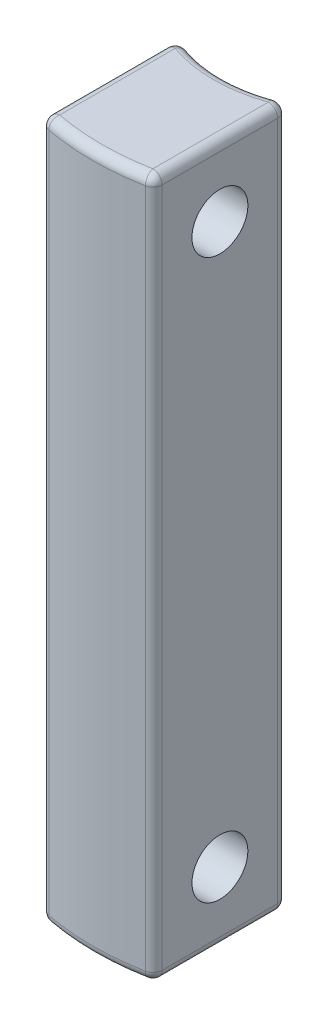
ISO-10303-21;
HEADER;
FILE_DESCRIPTION(('STEP AP214'),'2;1');
FILE_NAME('part.step','',(''),(''),'','','');
FILE_SCHEMA(('AUTOMOTIVE_DESIGN { 1 0 10303 214 1 1 1 1 }'));
ENDSEC;
DATA;
#1=APPLICATION_CONTEXT('core data for automotive mechanical design processes');
#2=APPLICATION_PROTOCOL_DEFINITION('international standard','automotive_design',2000,#1);
#3=PRODUCT_CONTEXT('',#1,'mechanical');
#4=PRODUCT('Part','Part','',(#3));
#5=PRODUCT_RELATED_PRODUCT_CATEGORY('part','',(#4));
#6=PRODUCT_DEFINITION_FORMATION('','',#4);
#7=PRODUCT_DEFINITION_CONTEXT('part definition',#1,'design');
#8=PRODUCT_DEFINITION('design','',#6,#7);
#9=PRODUCT_DEFINITION_SHAPE('','',#8);
#10=(LENGTH_UNIT() NAMED_UNIT(*) SI_UNIT(.MILLI.,.METRE.));
#11=(NAMED_UNIT(*) PLANE_ANGLE_UNIT() SI_UNIT($,.RADIAN.));
#12=(NAMED_UNIT(*) SI_UNIT($,.STERADIAN.) SOLID_ANGLE_UNIT());
#13=UNCERTAINTY_MEASURE_WITH_UNIT(LENGTH_MEASURE(1.E-05),#10,'distance_accuracy_value','');
#14=(GEOMETRIC_REPRESENTATION_CONTEXT(3) GLOBAL_UNCERTAINTY_ASSIGNED_CONTEXT((#13)) GLOBAL_UNIT_ASSIGNED_CONTEXT((#10,
#11,#12)) REPRESENTATION_CONTEXT('',''));
#15=CARTESIAN_POINT('',(0.,0.,0.));
#16=DIRECTION('',(0.,0.,1.));
#17=DIRECTION('',(1.,0.,0.));
#18=AXIS2_PLACEMENT_3D('',#15,#16,#17);
#19=CARTESIAN_POINT('',(-5.,75.,26.5329983228432));
#20=DIRECTION('',(0.,-1.,0.));
#21=DIRECTION('',(0.,0.,-1.));
#22=AXIS2_PLACEMENT_3D('',#19,#20,#21);
#23=CYLINDRICAL_SURFACE('',#22,1.);
#24=DIRECTION('',(0.,-1.,0.));
#25=VECTOR('',#24,1.);
#26=CARTESIAN_POINT('',(-6.,75.,26.5329983228432));
#27=LINE('',#26,#25);
#28=CARTESIAN_POINT('',(-6.,74.,26.5329983228432));
#29=VERTEX_POINT('',#28);
#30=CARTESIAN_POINT('',(-6.,1.,26.5329983228432));
#31=VERTEX_POINT('',#30);
#32=EDGE_CURVE('E270',#29,#31,#27,.T.);
#33=ORIENTED_EDGE('',*,*,#32,.T.);
#34=CARTESIAN_POINT('',(-5.,1.,26.5329983228432));
#35=DIRECTION('',(0.,-1.,0.));
#36=DIRECTION('',(0.,0.,-1.));
#37=AXIS2_PLACEMENT_3D('',#34,#35,#36);
#38=CIRCLE('',#37,1.);
#39=CARTESIAN_POINT('',(-5.18518518518518,1.,27.51570196443));
#40=VERTEX_POINT('',#39);
#41=EDGE_CURVE('E230',#31,#40,#38,.F.);
#42=ORIENTED_EDGE('',*,*,#41,.T.);
#43=DIRECTION('',(0.,-1.,0.));
#44=VECTOR('',#43,1.);
#45=CARTESIAN_POINT('',(-5.18518518518518,75.,27.51570196443));
#46=LINE('',#45,#44);
#47=CARTESIAN_POINT('',(-5.18518518518518,74.,27.51570196443));
#48=VERTEX_POINT('',#47);
#49=EDGE_CURVE('E158',#48,#40,#46,.T.);
#50=ORIENTED_EDGE('',*,*,#49,.F.);
#51=CARTESIAN_POINT('',(-5.,74.,26.5329983228432));
#52=DIRECTION('',(0.,-1.,0.));
#53=DIRECTION('',(0.,0.,-1.));
#54=AXIS2_PLACEMENT_3D('',#51,#52,#53);
#55=CIRCLE('',#54,1.);
#56=EDGE_CURVE('E227',#48,#29,#55,.T.);
#57=ORIENTED_EDGE('',*,*,#56,.T.);
#58=EDGE_LOOP('',(#33,#42,#50,#57));
#59=FACE_BOUND('',#58,.T.);
#60=ADVANCED_FACE('F43',(#59),#23,.T.);
#61=CARTESIAN_POINT('',(0.,75.,0.));
#62=DIRECTION('',(0.,-1.,0.));
#63=DIRECTION('',(0.,0.,-1.));
#64=AXIS2_PLACEMENT_3D('',#61,#62,#63);
#65=CYLINDRICAL_SURFACE('',#64,28.);
#66=ORIENTED_EDGE('',*,*,#49,.T.);
#67=CARTESIAN_POINT('',(0.,1.,0.));
#68=DIRECTION('',(0.,-1.,0.));
#69=DIRECTION('',(0.,0.,-1.));
#70=AXIS2_PLACEMENT_3D('',#67,#68,#69);
#71=CIRCLE('',#70,28.);
#72=CARTESIAN_POINT('',(5.18518518518517,1.,27.51570196443));
#73=VERTEX_POINT('',#72);
#74=EDGE_CURVE('E156',#40,#73,#71,.F.);
#75=ORIENTED_EDGE('',*,*,#74,.T.);
#76=DIRECTION('',(0.,-1.,0.));
#77=VECTOR('',#76,1.);
#78=CARTESIAN_POINT('',(5.18518518518517,75.,27.51570196443));
#79=LINE('',#78,#77);
#80=CARTESIAN_POINT('',(5.18518518518517,74.,27.51570196443));
#81=VERTEX_POINT('',#80);
#82=EDGE_CURVE('E137',#81,#73,#79,.T.);
#83=ORIENTED_EDGE('',*,*,#82,.F.);
#84=CARTESIAN_POINT('',(0.,74.,0.));
#85=DIRECTION('',(0.,-1.,0.));
#86=DIRECTION('',(0.,0.,-1.));
#87=AXIS2_PLACEMENT_3D('',#84,#85,#86);
#88=CIRCLE('',#87,28.);
#89=EDGE_CURVE('E153',#81,#48,#88,.T.);
#90=ORIENTED_EDGE('',*,*,#89,.T.);
#91=EDGE_LOOP('',(#66,#75,#83,#90));
#92=FACE_BOUND('',#91,.T.);
#93=ADVANCED_FACE('F151',(#92),#65,.T.);
#94=CARTESIAN_POINT('',(5.,75.,26.5329983228432));
#95=DIRECTION('',(0.,-1.,0.));
#96=DIRECTION('',(0.,0.,-1.));
#97=AXIS2_PLACEMENT_3D('',#94,#95,#96);
#98=CYLINDRICAL_SURFACE('',#97,1.);
#99=ORIENTED_EDGE('',*,*,#82,.T.);
#100=CARTESIAN_POINT('',(5.,1.,26.5329983228432));
#101=DIRECTION('',(0.,-1.,0.));
#102=DIRECTION('',(0.,0.,-1.));
#103=AXIS2_PLACEMENT_3D('',#100,#101,#102);
#104=CIRCLE('',#103,1.);
#105=CARTESIAN_POINT('',(6.,1.,26.5329983228432));
#106=VERTEX_POINT('',#105);
#107=EDGE_CURVE('E145',#73,#106,#104,.F.);
#108=ORIENTED_EDGE('',*,*,#107,.T.);
#109=DIRECTION('',(0.,-1.,0.));
#110=VECTOR('',#109,1.);
#111=CARTESIAN_POINT('',(6.,75.,26.5329983228432));
#112=LINE('',#111,#110);
#113=CARTESIAN_POINT('',(6.,74.,26.5329983228432));
#114=VERTEX_POINT('',#113);
#115=EDGE_CURVE('E139',#114,#106,#112,.T.);
#116=ORIENTED_EDGE('',*,*,#115,.F.);
#117=CARTESIAN_POINT('',(5.,74.,26.5329983228432));
#118=DIRECTION('',(0.,-1.,0.));
#119=DIRECTION('',(0.,0.,-1.));
#120=AXIS2_PLACEMENT_3D('',#117,#118,#119);
#121=CIRCLE('',#120,1.);
#122=EDGE_CURVE('E134',#114,#81,#121,.T.);
#123=ORIENTED_EDGE('',*,*,#122,.T.);
#124=EDGE_LOOP('',(#99,#108,#116,#123));
#125=FACE_BOUND('',#124,.T.);
#126=ADVANCED_FACE('F136',(#125),#98,.T.);
#127=CARTESIAN_POINT('',(6.,75.,14.142135623731));
#128=DIRECTION('',(-1.,0.,0.));
#129=DIRECTION('',(0.,0.,1.));
#130=AXIS2_PLACEMENT_3D('',#127,#128,#129);
#131=PLANE('',#130);
#132=CARTESIAN_POINT('',(6.,7.49999999999999,20.3375669732871));
#133=DIRECTION('',(1.,0.,0.));
#134=DIRECTION('',(0.,0.,-1.));
#135=AXIS2_PLACEMENT_3D('',#132,#133,#134);
#136=CIRCLE('',#135,3.);
#137=CARTESIAN_POINT('',(6.,7.49999999999999,17.3375669732871));
#138=VERTEX_POINT('',#137);
#139=EDGE_CURVE('E330',#138,#138,#136,.T.);
#140=ORIENTED_EDGE('',*,*,#139,.F.);
#141=EDGE_LOOP('',(#140));
#142=FACE_BOUND('',#141,.T.);
#143=CARTESIAN_POINT('',(6.,67.5,20.3375669732871));
#144=DIRECTION('',(1.,0.,0.));
#145=DIRECTION('',(0.,0.,1.));
#146=AXIS2_PLACEMENT_3D('',#143,#144,#145);
#147=CIRCLE('',#146,3.);
#148=CARTESIAN_POINT('',(6.,67.5,23.3375669732871));
#149=VERTEX_POINT('',#148);
#150=EDGE_CURVE('E326',#149,#149,#147,.T.);
#151=ORIENTED_EDGE('',*,*,#150,.F.);
#152=EDGE_LOOP('',(#151));
#153=FACE_BOUND('',#152,.T.);
#154=ORIENTED_EDGE('',*,*,#115,.T.);
#155=DIRECTION('',(0.,0.,-1.));
#156=VECTOR('',#155,1.);
#157=CARTESIAN_POINT('',(6.,1.,14.142135623731));
#158=LINE('',#157,#156);
#159=CARTESIAN_POINT('',(6.,1.,14.142135623731));
#160=VERTEX_POINT('',#159);
#161=EDGE_CURVE('E199',#106,#160,#158,.T.);
#162=ORIENTED_EDGE('',*,*,#161,.T.);
#163=DIRECTION('',(0.,-1.,0.));
#164=VECTOR('',#163,1.);
#165=CARTESIAN_POINT('',(6.,75.,14.142135623731));
#166=LINE('',#165,#164);
#167=CARTESIAN_POINT('',(6.,74.,14.142135623731));
#168=VERTEX_POINT('',#167);
#169=EDGE_CURVE('E299',#168,#160,#166,.T.);
#170=ORIENTED_EDGE('',*,*,#169,.F.);
#171=DIRECTION('',(0.,0.,-1.));
#172=VECTOR('',#171,1.);
#173=CARTESIAN_POINT('',(6.,74.,14.142135623731));
#174=LINE('',#173,#172);
#175=EDGE_CURVE('E196',#168,#114,#174,.F.);
#176=ORIENTED_EDGE('',*,*,#175,.T.);
#177=EDGE_LOOP('',(#154,#162,#170,#176));
#178=FACE_BOUND('',#177,.T.);
#179=ADVANCED_FACE('F296',(#142,#153,#178),#131,.F.);
#180=CARTESIAN_POINT('',(5.,75.,14.142135623731));
#181=DIRECTION('',(0.,-1.,0.));
#182=DIRECTION('',(0.,0.,-1.));
#183=AXIS2_PLACEMENT_3D('',#180,#181,#182);
#184=CYLINDRICAL_SURFACE('',#183,0.999999999999999);
#185=ORIENTED_EDGE('',*,*,#169,.T.);
#186=CARTESIAN_POINT('',(5.,1.,14.142135623731));
#187=DIRECTION('',(0.,-1.,0.));
#188=DIRECTION('',(0.,0.,-1.));
#189=AXIS2_PLACEMENT_3D('',#186,#187,#188);
#190=CIRCLE('',#189,0.999999999999999);
#191=CARTESIAN_POINT('',(4.66666666666667,1.,13.1993265821489));
#192=VERTEX_POINT('',#191);
#193=EDGE_CURVE('E205',#160,#192,#190,.F.);
#194=ORIENTED_EDGE('',*,*,#193,.T.);
#195=DIRECTION('',(0.,-1.,0.));
#196=VECTOR('',#195,1.);
#197=CARTESIAN_POINT('',(4.66666666666667,75.,13.1993265821489));
#198=LINE('',#197,#196);
#199=CARTESIAN_POINT('',(4.66666666666667,74.,13.1993265821489));
#200=VERTEX_POINT('',#199);
#201=EDGE_CURVE('E303',#200,#192,#198,.T.);
#202=ORIENTED_EDGE('',*,*,#201,.F.);
#203=CARTESIAN_POINT('',(5.,74.,14.142135623731));
#204=DIRECTION('',(0.,-1.,0.));
#205=DIRECTION('',(0.,0.,-1.));
#206=AXIS2_PLACEMENT_3D('',#203,#204,#205);
#207=CIRCLE('',#206,0.999999999999999);
#208=EDGE_CURVE('E202',#200,#168,#207,.T.);
#209=ORIENTED_EDGE('',*,*,#208,.T.);
#210=EDGE_LOOP('',(#185,#194,#202,#209));
#211=FACE_BOUND('',#210,.T.);
#212=ADVANCED_FACE('F350',(#211),#184,.T.);
#213=CARTESIAN_POINT('',(0.,75.,0.));
#214=DIRECTION('',(0.,-1.,0.));
#215=DIRECTION('',(0.,0.,-1.));
#216=AXIS2_PLACEMENT_3D('',#213,#214,#215);
#217=CYLINDRICAL_SURFACE('',#216,14.);
#218=ORIENTED_EDGE('',*,*,#201,.T.);
#219=CARTESIAN_POINT('',(0.,1.,0.));
#220=DIRECTION('',(0.,-1.,0.));
#221=DIRECTION('',(0.,0.,-1.));
#222=AXIS2_PLACEMENT_3D('',#219,#220,#221);
#223=CIRCLE('',#222,14.);
#224=CARTESIAN_POINT('',(-4.66666666666667,1.,13.1993265821489));
#225=VERTEX_POINT('',#224);
#226=EDGE_CURVE('E211',#192,#225,#223,.T.);
#227=ORIENTED_EDGE('',*,*,#226,.T.);
#228=DIRECTION('',(0.,-1.,0.));
#229=VECTOR('',#228,1.);
#230=CARTESIAN_POINT('',(-4.66666666666667,75.,13.1993265821489));
#231=LINE('',#230,#229);
#232=CARTESIAN_POINT('',(-4.66666666666667,74.,13.1993265821489));
#233=VERTEX_POINT('',#232);
#234=EDGE_CURVE('E309',#233,#225,#231,.T.);
#235=ORIENTED_EDGE('',*,*,#234,.F.);
#236=CARTESIAN_POINT('',(0.,74.,0.));
#237=DIRECTION('',(0.,-1.,0.));
#238=DIRECTION('',(0.,0.,-1.));
#239=AXIS2_PLACEMENT_3D('',#236,#237,#238);
#240=CIRCLE('',#239,14.);
#241=EDGE_CURVE('E208',#233,#200,#240,.F.);
#242=ORIENTED_EDGE('',*,*,#241,.T.);
#243=EDGE_LOOP('',(#218,#227,#235,#242));
#244=FACE_BOUND('',#243,.T.);
#245=ADVANCED_FACE('F487',(#244),#217,.F.);
#246=CARTESIAN_POINT('',(-5.,75.,14.142135623731));
#247=DIRECTION('',(0.,-1.,0.));
#248=DIRECTION('',(0.,0.,-1.));
#249=AXIS2_PLACEMENT_3D('',#246,#247,#248);
#250=CYLINDRICAL_SURFACE('',#249,0.999999999999999);
#251=ORIENTED_EDGE('',*,*,#234,.T.);
#252=CARTESIAN_POINT('',(-5.,1.,14.142135623731));
#253=DIRECTION('',(0.,-1.,0.));
#254=DIRECTION('',(0.,0.,-1.));
#255=AXIS2_PLACEMENT_3D('',#252,#253,#254);
#256=CIRCLE('',#255,0.999999999999999);
#257=CARTESIAN_POINT('',(-6.,1.,14.142135623731));
#258=VERTEX_POINT('',#257);
#259=EDGE_CURVE('E217',#225,#258,#256,.F.);
#260=ORIENTED_EDGE('',*,*,#259,.T.);
#261=DIRECTION('',(0.,-1.,0.));
#262=VECTOR('',#261,1.);
#263=CARTESIAN_POINT('',(-6.,75.,14.142135623731));
#264=LINE('',#263,#262);
#265=CARTESIAN_POINT('',(-6.,74.,14.142135623731));
#266=VERTEX_POINT('',#265);
#267=EDGE_CURVE('E315',#266,#258,#264,.T.);
#268=ORIENTED_EDGE('',*,*,#267,.F.);
#269=CARTESIAN_POINT('',(-5.,74.,14.142135623731));
#270=DIRECTION('',(0.,-1.,0.));
#271=DIRECTION('',(0.,0.,-1.));
#272=AXIS2_PLACEMENT_3D('',#269,#270,#271);
#273=CIRCLE('',#272,0.999999999999999);
#274=EDGE_CURVE('E214',#266,#233,#273,.T.);
#275=ORIENTED_EDGE('',*,*,#274,.T.);
#276=EDGE_LOOP('',(#251,#260,#268,#275));
#277=FACE_BOUND('',#276,.T.);
#278=ADVANCED_FACE('F480',(#277),#250,.T.);
#279=CARTESIAN_POINT('',(-6.,75.,14.142135623731));
#280=DIRECTION('',(1.,0.,0.));
#281=DIRECTION('',(0.,0.,-1.));
#282=AXIS2_PLACEMENT_3D('',#279,#280,#281);
#283=PLANE('',#282);
#284=CARTESIAN_POINT('',(-6.,7.49999999999999,20.3375669732871));
#285=DIRECTION('',(1.,0.,0.));
#286=DIRECTION('',(0.,0.,-1.));
#287=AXIS2_PLACEMENT_3D('',#284,#285,#286);
#288=CIRCLE('',#287,3.);
#289=CARTESIAN_POINT('',(-6.,7.49999999999999,17.3375669732871));
#290=VERTEX_POINT('',#289);
#291=EDGE_CURVE('E275',#290,#290,#288,.T.);
#292=ORIENTED_EDGE('',*,*,#291,.T.);
#293=EDGE_LOOP('',(#292));
#294=FACE_BOUND('',#293,.T.);
#295=CARTESIAN_POINT('',(-6.,67.5,20.3375669732871));
#296=DIRECTION('',(1.,0.,0.));
#297=DIRECTION('',(0.,0.,1.));
#298=AXIS2_PLACEMENT_3D('',#295,#296,#297);
#299=CIRCLE('',#298,3.);
#300=CARTESIAN_POINT('',(-6.,67.5,23.3375669732871));
#301=VERTEX_POINT('',#300);
#302=EDGE_CURVE('E322',#301,#301,#299,.T.);
#303=ORIENTED_EDGE('',*,*,#302,.T.);
#304=EDGE_LOOP('',(#303));
#305=FACE_BOUND('',#304,.T.);
#306=ORIENTED_EDGE('',*,*,#267,.T.);
#307=DIRECTION('',(0.,0.,1.));
#308=VECTOR('',#307,1.);
#309=CARTESIAN_POINT('',(-6.,1.,26.5329983228432));
#310=LINE('',#309,#308);
#311=EDGE_CURVE('E224',#258,#31,#310,.T.);
#312=ORIENTED_EDGE('',*,*,#311,.T.);
#313=ORIENTED_EDGE('',*,*,#32,.F.);
#314=DIRECTION('',(0.,0.,1.));
#315=VECTOR('',#314,1.);
#316=CARTESIAN_POINT('',(-6.,74.,14.142135623731));
#317=LINE('',#316,#315);
#318=EDGE_CURVE('E220',#29,#266,#317,.F.);
#319=ORIENTED_EDGE('',*,*,#318,.T.);
#320=EDGE_LOOP('',(#306,#312,#313,#319));
#321=FACE_BOUND('',#320,.T.);
#322=ADVANCED_FACE('F338',(#294,#305,#321),#283,.F.);
#323=CARTESIAN_POINT('',(-5.,75.,26.5329983228432));
#324=DIRECTION('',(0.,-1.,0.));
#325=DIRECTION('',(0.,0.,-1.));
#326=AXIS2_PLACEMENT_3D('',#323,#324,#325);
#327=PLANE('',#326);
#328=CARTESIAN_POINT('',(0.,75.,0.));
#329=DIRECTION('',(0.,-1.,0.));
#330=DIRECTION('',(0.,0.,-1.));
#331=AXIS2_PLACEMENT_3D('',#328,#329,#330);
#332=CIRCLE('',#331,15.);
#333=CARTESIAN_POINT('',(5.,75.,14.142135623731));
#334=VERTEX_POINT('',#333);
#335=CARTESIAN_POINT('',(-5.,75.,14.142135623731));
#336=VERTEX_POINT('',#335);
#337=EDGE_CURVE('E53',#334,#336,#332,.T.);
#338=ORIENTED_EDGE('',*,*,#337,.T.);
#339=DIRECTION('',(0.,0.,1.));
#340=VECTOR('',#339,1.);
#341=CARTESIAN_POINT('',(-5.,75.,26.5329983228432));
#342=LINE('',#341,#340);
#343=CARTESIAN_POINT('',(-4.99999999999999,75.,26.5329983228432));
#344=VERTEX_POINT('',#343);
#345=EDGE_CURVE('E11',#336,#344,#342,.T.);
#346=ORIENTED_EDGE('',*,*,#345,.T.);
#347=CARTESIAN_POINT('',(0.,75.,0.));
#348=DIRECTION('',(0.,-1.,0.));
#349=DIRECTION('',(0.,0.,-1.));
#350=AXIS2_PLACEMENT_3D('',#347,#348,#349);
#351=CIRCLE('',#350,27.);
#352=CARTESIAN_POINT('',(5.,75.,26.5329983228432));
#353=VERTEX_POINT('',#352);
#354=EDGE_CURVE('E233',#344,#353,#351,.F.);
#355=ORIENTED_EDGE('',*,*,#354,.T.);
#356=DIRECTION('',(0.,0.,-1.));
#357=VECTOR('',#356,1.);
#358=CARTESIAN_POINT('',(5.,75.,26.5329983228432));
#359=LINE('',#358,#357);
#360=EDGE_CURVE('E64',#353,#334,#359,.T.);
#361=ORIENTED_EDGE('',*,*,#360,.T.);
#362=EDGE_LOOP('',(#338,#346,#355,#361));
#363=FACE_BOUND('',#362,.T.);
#364=ADVANCED_FACE('F466',(#363),#327,.F.);
#365=CARTESIAN_POINT('',(-5.,0.,26.5329983228432));
#366=DIRECTION('',(0.,-1.,0.));
#367=DIRECTION('',(0.,0.,-1.));
#368=AXIS2_PLACEMENT_3D('',#365,#366,#367);
#369=PLANE('',#368);
#370=DIRECTION('',(0.,0.,-1.));
#371=VECTOR('',#370,1.);
#372=CARTESIAN_POINT('',(5.,0.,26.5329983228432));
#373=LINE('',#372,#371);
#374=CARTESIAN_POINT('',(5.,0.,14.142135623731));
#375=VERTEX_POINT('',#374);
#376=CARTESIAN_POINT('',(5.,0.,26.5329983228432));
#377=VERTEX_POINT('',#376);
#378=EDGE_CURVE('E188',#375,#377,#373,.F.);
#379=ORIENTED_EDGE('',*,*,#378,.T.);
#380=CARTESIAN_POINT('',(0.,0.,0.));
#381=DIRECTION('',(0.,-1.,0.));
#382=DIRECTION('',(0.,0.,-1.));
#383=AXIS2_PLACEMENT_3D('',#380,#381,#382);
#384=CIRCLE('',#383,27.);
#385=CARTESIAN_POINT('',(-5.,0.,26.5329983228432));
#386=VERTEX_POINT('',#385);
#387=EDGE_CURVE('E146',#377,#386,#384,.T.);
#388=ORIENTED_EDGE('',*,*,#387,.T.);
#389=DIRECTION('',(0.,0.,1.));
#390=VECTOR('',#389,1.);
#391=CARTESIAN_POINT('',(-5.,0.,14.142135623731));
#392=LINE('',#391,#390);
#393=CARTESIAN_POINT('',(-5.,0.,14.142135623731));
#394=VERTEX_POINT('',#393);
#395=EDGE_CURVE('E179',#386,#394,#392,.F.);
#396=ORIENTED_EDGE('',*,*,#395,.T.);
#397=CARTESIAN_POINT('',(0.,0.,0.));
#398=DIRECTION('',(0.,-1.,0.));
#399=DIRECTION('',(0.,0.,-1.));
#400=AXIS2_PLACEMENT_3D('',#397,#398,#399);
#401=CIRCLE('',#400,15.);
#402=EDGE_CURVE('E185',#394,#375,#401,.F.);
#403=ORIENTED_EDGE('',*,*,#402,.T.);
#404=EDGE_LOOP('',(#379,#388,#396,#403));
#405=FACE_BOUND('',#404,.T.);
#406=ADVANCED_FACE('F405',(#405),#369,.T.);
#407=CARTESIAN_POINT('',(0.,1.,0.));
#408=DIRECTION('',(0.,-1.,0.));
#409=DIRECTION('',(0.,0.,-1.));
#410=AXIS2_PLACEMENT_3D('',#407,#408,#409);
#411=TOROIDAL_SURFACE('',#410,15.,1.);
#412=CARTESIAN_POINT('',(-5.,1.,14.142135623731));
#413=DIRECTION('',(-0.942809041582063,0.,-0.333333333333333));
#414=DIRECTION('',(-0.333333333333333,0.,0.942809041582063));
#415=AXIS2_PLACEMENT_3D('',#412,#413,#414);
#416=CIRCLE('',#415,1.);
#417=EDGE_CURVE('E266',#225,#394,#416,.T.);
#418=ORIENTED_EDGE('',*,*,#417,.F.);
#419=ORIENTED_EDGE('',*,*,#226,.F.);
#420=CARTESIAN_POINT('',(5.,1.,14.142135623731));
#421=DIRECTION('',(0.942809041582063,0.,-0.333333333333334));
#422=DIRECTION('',(-0.333333333333334,0.,-0.942809041582063));
#423=AXIS2_PLACEMENT_3D('',#420,#421,#422);
#424=CIRCLE('',#423,1.);
#425=EDGE_CURVE('E262',#375,#192,#424,.T.);
#426=ORIENTED_EDGE('',*,*,#425,.F.);
#427=ORIENTED_EDGE('',*,*,#402,.F.);
#428=EDGE_LOOP('',(#418,#419,#426,#427));
#429=FACE_BOUND('',#428,.T.);
#430=ADVANCED_FACE('F402',(#429),#411,.T.);
#431=CARTESIAN_POINT('',(-5.,1.,14.142135623731));
#432=DIRECTION('',(0.,-1.,0.));
#433=DIRECTION('',(0.,0.,-1.));
#434=AXIS2_PLACEMENT_3D('',#431,#432,#433);
#435=SPHERICAL_SURFACE('',#434,1.);
#436=ORIENTED_EDGE('',*,*,#259,.F.);
#437=ORIENTED_EDGE('',*,*,#417,.T.);
#438=CARTESIAN_POINT('',(-5.,1.,14.142135623731));
#439=DIRECTION('',(0.,0.,1.));
#440=DIRECTION('',(1.,0.,0.));
#441=AXIS2_PLACEMENT_3D('',#438,#439,#440);
#442=CIRCLE('',#441,1.);
#443=EDGE_CURVE('E258',#258,#394,#442,.T.);
#444=ORIENTED_EDGE('',*,*,#443,.F.);
#445=EDGE_LOOP('',(#436,#437,#444));
#446=FACE_BOUND('',#445,.T.);
#447=ADVANCED_FACE('F398',(#446),#435,.T.);
#448=CARTESIAN_POINT('',(5.,1.,14.142135623731));
#449=DIRECTION('',(0.,-1.,0.));
#450=DIRECTION('',(0.,0.,-1.));
#451=AXIS2_PLACEMENT_3D('',#448,#449,#450);
#452=SPHERICAL_SURFACE('',#451,1.);
#453=ORIENTED_EDGE('',*,*,#425,.T.);
#454=ORIENTED_EDGE('',*,*,#193,.F.);
#455=CARTESIAN_POINT('',(5.,1.,14.142135623731));
#456=DIRECTION('',(0.,0.,1.));
#457=DIRECTION('',(1.,0.,0.));
#458=AXIS2_PLACEMENT_3D('',#455,#456,#457);
#459=CIRCLE('',#458,1.);
#460=EDGE_CURVE('E254',#375,#160,#459,.T.);
#461=ORIENTED_EDGE('',*,*,#460,.F.);
#462=EDGE_LOOP('',(#453,#454,#461));
#463=FACE_BOUND('',#462,.T.);
#464=ADVANCED_FACE('F394',(#463),#452,.T.);
#465=CARTESIAN_POINT('',(-5.,1.,14.142135623731));
#466=DIRECTION('',(0.,0.,-1.));
#467=DIRECTION('',(-1.,0.,0.));
#468=AXIS2_PLACEMENT_3D('',#465,#466,#467);
#469=CYLINDRICAL_SURFACE('',#468,1.);
#470=ORIENTED_EDGE('',*,*,#443,.T.);
#471=ORIENTED_EDGE('',*,*,#395,.F.);
#472=CARTESIAN_POINT('',(-5.,1.,26.5329983228432));
#473=DIRECTION('',(0.,0.,1.));
#474=DIRECTION('',(1.,0.,0.));
#475=AXIS2_PLACEMENT_3D('',#472,#473,#474);
#476=CIRCLE('',#475,1.);
#477=EDGE_CURVE('E250',#31,#386,#476,.T.);
#478=ORIENTED_EDGE('',*,*,#477,.F.);
#479=ORIENTED_EDGE('',*,*,#311,.F.);
#480=EDGE_LOOP('',(#470,#471,#478,#479));
#481=FACE_BOUND('',#480,.T.);
#482=ADVANCED_FACE('F390',(#481),#469,.T.);
#483=CARTESIAN_POINT('',(5.,1.,14.142135623731));
#484=DIRECTION('',(0.,0.,1.));
#485=DIRECTION('',(1.,0.,0.));
#486=AXIS2_PLACEMENT_3D('',#483,#484,#485);
#487=CYLINDRICAL_SURFACE('',#486,1.);
#488=ORIENTED_EDGE('',*,*,#460,.T.);
#489=ORIENTED_EDGE('',*,*,#161,.F.);
#490=CARTESIAN_POINT('',(5.,1.,26.5329983228432));
#491=DIRECTION('',(0.,0.,1.));
#492=DIRECTION('',(1.,0.,0.));
#493=AXIS2_PLACEMENT_3D('',#490,#491,#492);
#494=CIRCLE('',#493,1.);
#495=EDGE_CURVE('E246',#377,#106,#494,.T.);
#496=ORIENTED_EDGE('',*,*,#495,.F.);
#497=ORIENTED_EDGE('',*,*,#378,.F.);
#498=EDGE_LOOP('',(#488,#489,#496,#497));
#499=FACE_BOUND('',#498,.T.);
#500=ADVANCED_FACE('F386',(#499),#487,.T.);
#501=CARTESIAN_POINT('',(-5.,1.,26.5329983228432));
#502=DIRECTION('',(0.,-1.,0.));
#503=DIRECTION('',(0.,0.,-1.));
#504=AXIS2_PLACEMENT_3D('',#501,#502,#503);
#505=SPHERICAL_SURFACE('',#504,1.);
#506=ORIENTED_EDGE('',*,*,#41,.F.);
#507=ORIENTED_EDGE('',*,*,#477,.T.);
#508=CARTESIAN_POINT('',(-5.,1.,26.5329983228432));
#509=DIRECTION('',(0.982703641586786,0.,0.185185185185182));
#510=DIRECTION('',(0.185185185185182,0.,-0.982703641586786));
#511=AXIS2_PLACEMENT_3D('',#508,#509,#510);
#512=CIRCLE('',#511,1.);
#513=EDGE_CURVE('E243',#40,#386,#512,.T.);
#514=ORIENTED_EDGE('',*,*,#513,.F.);
#515=EDGE_LOOP('',(#506,#507,#514));
#516=FACE_BOUND('',#515,.T.);
#517=ADVANCED_FACE('F382',(#516),#505,.T.);
#518=CARTESIAN_POINT('',(5.,1.,26.5329983228432));
#519=DIRECTION('',(0.,-1.,0.));
#520=DIRECTION('',(0.,0.,-1.));
#521=AXIS2_PLACEMENT_3D('',#518,#519,#520);
#522=SPHERICAL_SURFACE('',#521,1.);
#523=ORIENTED_EDGE('',*,*,#495,.T.);
#524=ORIENTED_EDGE('',*,*,#107,.F.);
#525=CARTESIAN_POINT('',(5.,1.,26.5329983228432));
#526=DIRECTION('',(-0.982703641586787,0.,0.185185185185174));
#527=DIRECTION('',(0.185185185185174,0.,0.982703641586787));
#528=AXIS2_PLACEMENT_3D('',#525,#526,#527);
#529=CIRCLE('',#528,1.);
#530=EDGE_CURVE('E240',#377,#73,#529,.T.);
#531=ORIENTED_EDGE('',*,*,#530,.F.);
#532=EDGE_LOOP('',(#523,#524,#531));
#533=FACE_BOUND('',#532,.T.);
#534=ADVANCED_FACE('F378',(#533),#522,.T.);
#535=CARTESIAN_POINT('',(0.,1.,0.));
#536=DIRECTION('',(0.,-1.,0.));
#537=DIRECTION('',(0.,0.,-1.));
#538=AXIS2_PLACEMENT_3D('',#535,#536,#537);
#539=TOROIDAL_SURFACE('',#538,27.,1.);
#540=ORIENTED_EDGE('',*,*,#513,.T.);
#541=ORIENTED_EDGE('',*,*,#387,.F.);
#542=ORIENTED_EDGE('',*,*,#530,.T.);
#543=ORIENTED_EDGE('',*,*,#74,.F.);
#544=EDGE_LOOP('',(#540,#541,#542,#543));
#545=FACE_BOUND('',#544,.T.);
#546=ADVANCED_FACE('F375',(#545),#539,.T.);
#547=CARTESIAN_POINT('',(5.,74.,26.5329983228432));
#548=DIRECTION('',(0.,0.,-1.));
#549=DIRECTION('',(-1.,0.,0.));
#550=AXIS2_PLACEMENT_3D('',#547,#548,#549);
#551=CYLINDRICAL_SURFACE('',#550,1.);
#552=CARTESIAN_POINT('',(5.,74.,26.5329983228432));
#553=DIRECTION('',(0.,0.,1.));
#554=DIRECTION('',(1.,0.,0.));
#555=AXIS2_PLACEMENT_3D('',#552,#553,#554);
#556=CIRCLE('',#555,1.);
#557=EDGE_CURVE('E163',#114,#353,#556,.T.);
#558=ORIENTED_EDGE('',*,*,#557,.F.);
#559=ORIENTED_EDGE('',*,*,#175,.F.);
#560=CARTESIAN_POINT('',(5.,74.,14.142135623731));
#561=DIRECTION('',(0.,0.,-1.));
#562=DIRECTION('',(-1.,0.,0.));
#563=AXIS2_PLACEMENT_3D('',#560,#561,#562);
#564=CIRCLE('',#563,1.);
#565=EDGE_CURVE('E47',#334,#168,#564,.T.);
#566=ORIENTED_EDGE('',*,*,#565,.F.);
#567=ORIENTED_EDGE('',*,*,#360,.F.);
#568=EDGE_LOOP('',(#558,#559,#566,#567));
#569=FACE_BOUND('',#568,.T.);
#570=ADVANCED_FACE('F45',(#569),#551,.T.);
#571=CARTESIAN_POINT('',(5.,74.,14.142135623731));
#572=DIRECTION('',(0.,-1.,0.));
#573=DIRECTION('',(0.,0.,-1.));
#574=AXIS2_PLACEMENT_3D('',#571,#572,#573);
#575=SPHERICAL_SURFACE('',#574,1.);
#576=ORIENTED_EDGE('',*,*,#565,.T.);
#577=ORIENTED_EDGE('',*,*,#208,.F.);
#578=CARTESIAN_POINT('',(5.,74.,14.142135623731));
#579=DIRECTION('',(-0.942809041582063,0.,0.333333333333334));
#580=DIRECTION('',(0.333333333333334,0.,0.942809041582063));
#581=AXIS2_PLACEMENT_3D('',#578,#579,#580);
#582=CIRCLE('',#581,1.);
#583=EDGE_CURVE('E167',#334,#200,#582,.T.);
#584=ORIENTED_EDGE('',*,*,#583,.F.);
#585=EDGE_LOOP('',(#576,#577,#584));
#586=FACE_BOUND('',#585,.T.);
#587=ADVANCED_FACE('F291',(#586),#575,.T.);
#588=CARTESIAN_POINT('',(5.,74.,26.5329983228432));
#589=DIRECTION('',(0.,-1.,0.));
#590=DIRECTION('',(0.,0.,-1.));
#591=AXIS2_PLACEMENT_3D('',#588,#589,#590);
#592=SPHERICAL_SURFACE('',#591,1.);
#593=ORIENTED_EDGE('',*,*,#122,.F.);
#594=ORIENTED_EDGE('',*,*,#557,.T.);
#595=CARTESIAN_POINT('',(5.,74.,26.5329983228432));
#596=DIRECTION('',(-0.982703641586787,0.,0.185185185185174));
#597=DIRECTION('',(0.185185185185174,0.,0.982703641586787));
#598=AXIS2_PLACEMENT_3D('',#595,#596,#597);
#599=CIRCLE('',#598,1.);
#600=EDGE_CURVE('E161',#81,#353,#599,.T.);
#601=ORIENTED_EDGE('',*,*,#600,.F.);
#602=EDGE_LOOP('',(#593,#594,#601));
#603=FACE_BOUND('',#602,.T.);
#604=ADVANCED_FACE('F162',(#603),#592,.T.);
#605=CARTESIAN_POINT('',(0.,74.,0.));
#606=DIRECTION('',(0.,-1.,0.));
#607=DIRECTION('',(0.,0.,-1.));
#608=AXIS2_PLACEMENT_3D('',#605,#606,#607);
#609=TOROIDAL_SURFACE('',#608,15.,1.);
#610=ORIENTED_EDGE('',*,*,#583,.T.);
#611=ORIENTED_EDGE('',*,*,#241,.F.);
#612=CARTESIAN_POINT('',(-5.,74.,14.142135623731));
#613=DIRECTION('',(-0.942809041582064,0.,-0.333333333333331));
#614=DIRECTION('',(-0.333333333333331,0.,0.942809041582064));
#615=AXIS2_PLACEMENT_3D('',#612,#613,#614);
#616=CIRCLE('',#615,1.);
#617=EDGE_CURVE('E168',#336,#233,#616,.T.);
#618=ORIENTED_EDGE('',*,*,#617,.F.);
#619=ORIENTED_EDGE('',*,*,#337,.F.);
#620=EDGE_LOOP('',(#610,#611,#618,#619));
#621=FACE_BOUND('',#620,.T.);
#622=ADVANCED_FACE('F417',(#621),#609,.T.);
#623=CARTESIAN_POINT('',(0.,74.,0.));
#624=DIRECTION('',(0.,-1.,0.));
#625=DIRECTION('',(0.,0.,-1.));
#626=AXIS2_PLACEMENT_3D('',#623,#624,#625);
#627=TOROIDAL_SURFACE('',#626,27.,1.);
#628=ORIENTED_EDGE('',*,*,#600,.T.);
#629=ORIENTED_EDGE('',*,*,#354,.F.);
#630=CARTESIAN_POINT('',(-4.99999999999999,74.,26.5329983228432));
#631=DIRECTION('',(-0.982703641586785,0.,-0.185185185185185));
#632=DIRECTION('',(-0.185185185185185,0.,0.982703641586785));
#633=AXIS2_PLACEMENT_3D('',#630,#631,#632);
#634=CIRCLE('',#633,1.);
#635=EDGE_CURVE('E173',#48,#344,#634,.T.);
#636=ORIENTED_EDGE('',*,*,#635,.F.);
#637=ORIENTED_EDGE('',*,*,#89,.F.);
#638=EDGE_LOOP('',(#628,#629,#636,#637));
#639=FACE_BOUND('',#638,.T.);
#640=ADVANCED_FACE('F171',(#639),#627,.T.);
#641=CARTESIAN_POINT('',(-5.,74.,14.142135623731));
#642=DIRECTION('',(0.,-1.,0.));
#643=DIRECTION('',(0.,0.,-1.));
#644=AXIS2_PLACEMENT_3D('',#641,#642,#643);
#645=SPHERICAL_SURFACE('',#644,1.);
#646=ORIENTED_EDGE('',*,*,#617,.T.);
#647=ORIENTED_EDGE('',*,*,#274,.F.);
#648=CARTESIAN_POINT('',(-5.,74.,14.142135623731));
#649=DIRECTION('',(0.,0.,1.));
#650=DIRECTION('',(1.,0.,0.));
#651=AXIS2_PLACEMENT_3D('',#648,#649,#650);
#652=CIRCLE('',#651,1.);
#653=EDGE_CURVE('E274',#336,#266,#652,.T.);
#654=ORIENTED_EDGE('',*,*,#653,.F.);
#655=EDGE_LOOP('',(#646,#647,#654));
#656=FACE_BOUND('',#655,.T.);
#657=ADVANCED_FACE('F410',(#656),#645,.T.);
#658=CARTESIAN_POINT('',(-5.,74.,26.5329983228432));
#659=DIRECTION('',(0.,-1.,0.));
#660=DIRECTION('',(0.,0.,-1.));
#661=AXIS2_PLACEMENT_3D('',#658,#659,#660);
#662=SPHERICAL_SURFACE('',#661,1.);
#663=ORIENTED_EDGE('',*,*,#56,.F.);
#664=ORIENTED_EDGE('',*,*,#635,.T.);
#665=CARTESIAN_POINT('',(-5.,74.,26.5329983228432));
#666=DIRECTION('',(0.,0.,-1.));
#667=DIRECTION('',(-1.,0.,0.));
#668=AXIS2_PLACEMENT_3D('',#665,#666,#667);
#669=CIRCLE('',#668,1.);
#670=EDGE_CURVE('E271',#29,#344,#669,.T.);
#671=ORIENTED_EDGE('',*,*,#670,.F.);
#672=EDGE_LOOP('',(#663,#664,#671));
#673=FACE_BOUND('',#672,.T.);
#674=ADVANCED_FACE('F361',(#673),#662,.T.);
#675=CARTESIAN_POINT('',(-5.,74.,26.5329983228432));
#676=DIRECTION('',(0.,0.,1.));
#677=DIRECTION('',(1.,0.,0.));
#678=AXIS2_PLACEMENT_3D('',#675,#676,#677);
#679=CYLINDRICAL_SURFACE('',#678,1.);
#680=ORIENTED_EDGE('',*,*,#653,.T.);
#681=ORIENTED_EDGE('',*,*,#318,.F.);
#682=ORIENTED_EDGE('',*,*,#670,.T.);
#683=ORIENTED_EDGE('',*,*,#345,.F.);
#684=EDGE_LOOP('',(#680,#681,#682,#683));
#685=FACE_BOUND('',#684,.T.);
#686=ADVANCED_FACE('F355',(#685),#679,.T.);
#687=CARTESIAN_POINT('',(-6.,67.5,20.3375669732871));
#688=DIRECTION('',(1.,0.,0.));
#689=DIRECTION('',(0.,0.,-1.));
#690=AXIS2_PLACEMENT_3D('',#687,#688,#689);
#691=CYLINDRICAL_SURFACE('',#690,3.);
#692=ORIENTED_EDGE('',*,*,#302,.F.);
#693=EDGE_LOOP('',(#692));
#694=FACE_BOUND('',#693,.T.);
#695=ORIENTED_EDGE('',*,*,#150,.T.);
#696=EDGE_LOOP('',(#695));
#697=FACE_BOUND('',#696,.T.);
#698=ADVANCED_FACE('F344',(#694,#697),#691,.F.);
#699=CARTESIAN_POINT('',(-6.,7.49999999999999,20.3375669732871));
#700=DIRECTION('',(1.,0.,0.));
#701=DIRECTION('',(0.,0.,-1.));
#702=AXIS2_PLACEMENT_3D('',#699,#700,#701);
#703=CYLINDRICAL_SURFACE('',#702,3.);
#704=ORIENTED_EDGE('',*,*,#291,.F.);
#705=EDGE_LOOP('',(#704));
#706=FACE_BOUND('',#705,.T.);
#707=ORIENTED_EDGE('',*,*,#139,.T.);
#708=EDGE_LOOP('',(#707));
#709=FACE_BOUND('',#708,.T.);
#710=ADVANCED_FACE('F341',(#706,#709),#703,.F.);
#711=CLOSED_SHELL('',(#60,#93,#126,#179,#212,#245,#278,#322,#364,#406,#430,#447,#464,#482,#500,
#517,#534,#546,#570,#587,#604,#622,#640,#657,#674,#686,#698,#710));
#712=MANIFOLD_SOLID_BREP('B2',#711);
#713=ADVANCED_BREP_SHAPE_REPRESENTATION('',(#18,#712),#14);
#714=SHAPE_DEFINITION_REPRESENTATION(#9,#713);
ENDSEC;
END-ISO-10303-21;
